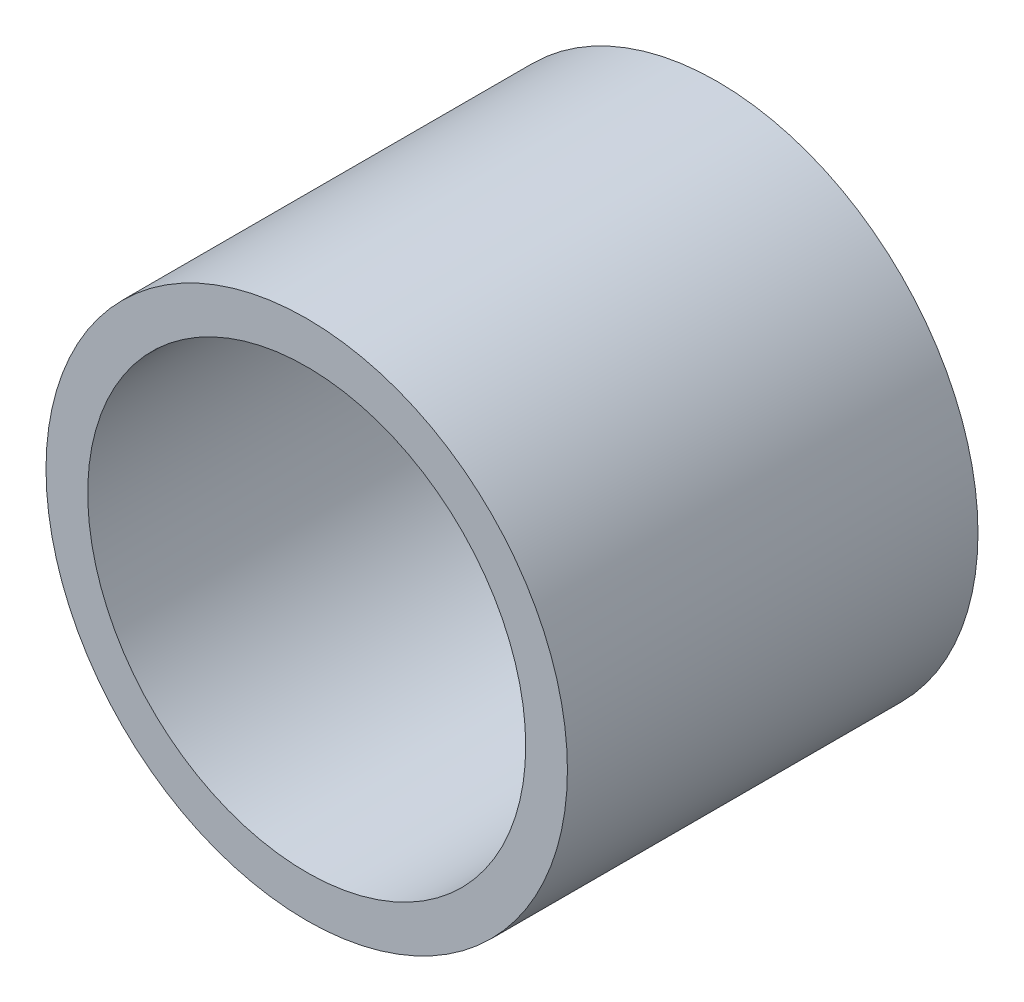
ISO-10303-21;
HEADER;
FILE_DESCRIPTION(('STEP AP214'),'2;1');
FILE_NAME('part.step','',(''),(''),'','','');
FILE_SCHEMA(('AUTOMOTIVE_DESIGN { 1 0 10303 214 1 1 1 1 }'));
ENDSEC;
DATA;
#1=APPLICATION_CONTEXT('core data for automotive mechanical design processes');
#2=APPLICATION_PROTOCOL_DEFINITION('international standard','automotive_design',2000,#1);
#3=PRODUCT_CONTEXT('',#1,'mechanical');
#4=PRODUCT('Part','Part','',(#3));
#5=PRODUCT_RELATED_PRODUCT_CATEGORY('part','',(#4));
#6=PRODUCT_DEFINITION_FORMATION('','',#4);
#7=PRODUCT_DEFINITION_CONTEXT('part definition',#1,'design');
#8=PRODUCT_DEFINITION('design','',#6,#7);
#9=PRODUCT_DEFINITION_SHAPE('','',#8);
#10=(LENGTH_UNIT() NAMED_UNIT(*) SI_UNIT(.MILLI.,.METRE.));
#11=(NAMED_UNIT(*) PLANE_ANGLE_UNIT() SI_UNIT($,.RADIAN.));
#12=(NAMED_UNIT(*) SI_UNIT($,.STERADIAN.) SOLID_ANGLE_UNIT());
#13=UNCERTAINTY_MEASURE_WITH_UNIT(LENGTH_MEASURE(1.E-05),#10,'distance_accuracy_value','');
#14=(GEOMETRIC_REPRESENTATION_CONTEXT(3) GLOBAL_UNCERTAINTY_ASSIGNED_CONTEXT((#13)) GLOBAL_UNIT_ASSIGNED_CONTEXT((#10,
#11,#12)) REPRESENTATION_CONTEXT('',''));
#15=CARTESIAN_POINT('',(0.,0.,0.));
#16=DIRECTION('',(0.,0.,1.));
#17=DIRECTION('',(1.,0.,0.));
#18=AXIS2_PLACEMENT_3D('',#15,#16,#17);
#19=CARTESIAN_POINT('',(0.,0.,5.));
#20=DIRECTION('',(0.,0.,1.));
#21=DIRECTION('',(1.,0.,0.));
#22=AXIS2_PLACEMENT_3D('',#19,#20,#21);
#23=PLANE('',#22);
#24=CARTESIAN_POINT('',(0.,0.,5.));
#25=DIRECTION('',(0.,0.,1.));
#26=DIRECTION('',(1.,0.,0.));
#27=AXIS2_PLACEMENT_3D('',#24,#25,#26);
#28=CIRCLE('',#27,3.175);
#29=CARTESIAN_POINT('',(3.175,0.,5.));
#30=VERTEX_POINT('',#29);
#31=EDGE_CURVE('E10',#30,#30,#28,.T.);
#32=ORIENTED_EDGE('',*,*,#31,.T.);
#33=EDGE_LOOP('',(#32));
#34=FACE_BOUND('',#33,.T.);
#35=CARTESIAN_POINT('',(0.,0.,5.));
#36=DIRECTION('',(0.,0.,1.));
#37=DIRECTION('',(1.,0.,0.));
#38=AXIS2_PLACEMENT_3D('',#35,#36,#37);
#39=CIRCLE('',#38,2.667);
#40=CARTESIAN_POINT('',(2.667,0.,5.));
#41=VERTEX_POINT('',#40);
#42=EDGE_CURVE('E50',#41,#41,#39,.T.);
#43=ORIENTED_EDGE('',*,*,#42,.F.);
#44=EDGE_LOOP('',(#43));
#45=FACE_BOUND('',#44,.T.);
#46=ADVANCED_FACE('F37',(#34,#45),#23,.T.);
#47=CARTESIAN_POINT('',(0.,0.,0.));
#48=DIRECTION('',(0.,0.,1.));
#49=DIRECTION('',(1.,0.,0.));
#50=AXIS2_PLACEMENT_3D('',#47,#48,#49);
#51=PLANE('',#50);
#52=CARTESIAN_POINT('',(0.,0.,0.));
#53=DIRECTION('',(0.,0.,1.));
#54=DIRECTION('',(1.,0.,0.));
#55=AXIS2_PLACEMENT_3D('',#52,#53,#54);
#56=CIRCLE('',#55,3.175);
#57=CARTESIAN_POINT('',(3.175,0.,0.));
#58=VERTEX_POINT('',#57);
#59=EDGE_CURVE('E41',#58,#58,#56,.T.);
#60=ORIENTED_EDGE('',*,*,#59,.F.);
#61=EDGE_LOOP('',(#60));
#62=FACE_BOUND('',#61,.T.);
#63=CARTESIAN_POINT('',(0.,0.,0.));
#64=DIRECTION('',(0.,0.,1.));
#65=DIRECTION('',(1.,0.,0.));
#66=AXIS2_PLACEMENT_3D('',#63,#64,#65);
#67=CIRCLE('',#66,2.667);
#68=CARTESIAN_POINT('',(2.667,0.,0.));
#69=VERTEX_POINT('',#68);
#70=EDGE_CURVE('E52',#69,#69,#67,.T.);
#71=ORIENTED_EDGE('',*,*,#70,.T.);
#72=EDGE_LOOP('',(#71));
#73=FACE_BOUND('',#72,.T.);
#74=ADVANCED_FACE('F64',(#62,#73),#51,.F.);
#75=CARTESIAN_POINT('',(0.,0.,5.));
#76=DIRECTION('',(0.,0.,-1.));
#77=DIRECTION('',(-1.,0.,0.));
#78=AXIS2_PLACEMENT_3D('',#75,#76,#77);
#79=CYLINDRICAL_SURFACE('',#78,3.175);
#80=ORIENTED_EDGE('',*,*,#31,.F.);
#81=EDGE_LOOP('',(#80));
#82=FACE_BOUND('',#81,.T.);
#83=ORIENTED_EDGE('',*,*,#59,.T.);
#84=EDGE_LOOP('',(#83));
#85=FACE_BOUND('',#84,.T.);
#86=ADVANCED_FACE('F39',(#82,#85),#79,.T.);
#87=CARTESIAN_POINT('',(0.,0.,5.));
#88=DIRECTION('',(0.,0.,-1.));
#89=DIRECTION('',(-1.,0.,0.));
#90=AXIS2_PLACEMENT_3D('',#87,#88,#89);
#91=CYLINDRICAL_SURFACE('',#90,2.667);
#92=ORIENTED_EDGE('',*,*,#42,.T.);
#93=EDGE_LOOP('',(#92));
#94=FACE_BOUND('',#93,.T.);
#95=ORIENTED_EDGE('',*,*,#70,.F.);
#96=EDGE_LOOP('',(#95));
#97=FACE_BOUND('',#96,.T.);
#98=ADVANCED_FACE('F60',(#94,#97),#91,.F.);
#99=CLOSED_SHELL('',(#46,#74,#86,#98));
#100=MANIFOLD_SOLID_BREP('B2',#99);
#101=ADVANCED_BREP_SHAPE_REPRESENTATION('',(#18,#100),#14);
#102=SHAPE_DEFINITION_REPRESENTATION(#9,#101);
ENDSEC;
END-ISO-10303-21;
